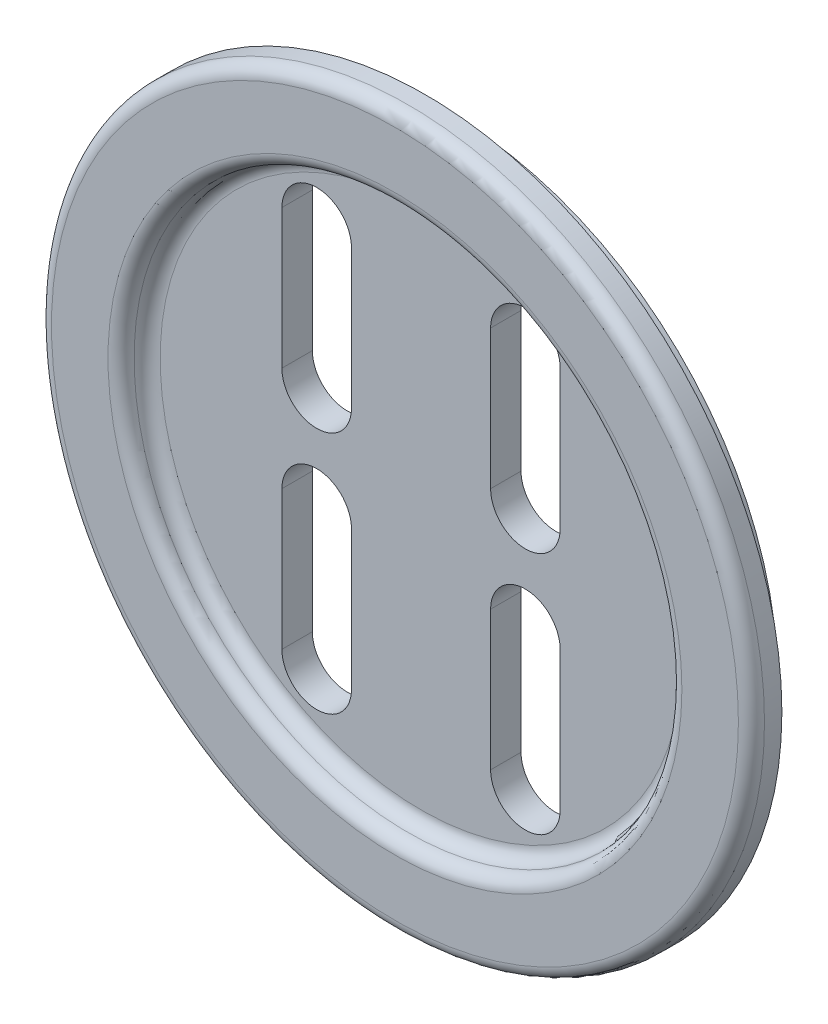
ISO-10303-21;
HEADER;
FILE_DESCRIPTION(('STEP AP214'),'2;1');
FILE_NAME('part.step','',(''),(''),'','','');
FILE_SCHEMA(('AUTOMOTIVE_DESIGN { 1 0 10303 214 1 1 1 1 }'));
ENDSEC;
DATA;
#1=APPLICATION_CONTEXT('core data for automotive mechanical design processes');
#2=APPLICATION_PROTOCOL_DEFINITION('international standard','automotive_design',2000,#1);
#3=PRODUCT_CONTEXT('',#1,'mechanical');
#4=PRODUCT('Part','Part','',(#3));
#5=PRODUCT_RELATED_PRODUCT_CATEGORY('part','',(#4));
#6=PRODUCT_DEFINITION_FORMATION('','',#4);
#7=PRODUCT_DEFINITION_CONTEXT('part definition',#1,'design');
#8=PRODUCT_DEFINITION('design','',#6,#7);
#9=PRODUCT_DEFINITION_SHAPE('','',#8);
#10=(LENGTH_UNIT() NAMED_UNIT(*) SI_UNIT(.MILLI.,.METRE.));
#11=(NAMED_UNIT(*) PLANE_ANGLE_UNIT() SI_UNIT($,.RADIAN.));
#12=(NAMED_UNIT(*) SI_UNIT($,.STERADIAN.) SOLID_ANGLE_UNIT());
#13=UNCERTAINTY_MEASURE_WITH_UNIT(LENGTH_MEASURE(1.E-05),#10,'distance_accuracy_value','');
#14=(GEOMETRIC_REPRESENTATION_CONTEXT(3) GLOBAL_UNCERTAINTY_ASSIGNED_CONTEXT((#13)) GLOBAL_UNIT_ASSIGNED_CONTEXT((#10,
#11,#12)) REPRESENTATION_CONTEXT('',''));
#15=CARTESIAN_POINT('',(0.,0.,0.));
#16=DIRECTION('',(0.,0.,1.));
#17=DIRECTION('',(1.,0.,0.));
#18=AXIS2_PLACEMENT_3D('',#15,#16,#17);
#19=CARTESIAN_POINT('',(0.,0.,-3.));
#20=DIRECTION('',(0.,0.,1.));
#21=DIRECTION('',(1.,0.,0.));
#22=AXIS2_PLACEMENT_3D('',#19,#20,#21);
#23=PLANE('',#22);
#24=DIRECTION('',(0.,-1.,0.));
#25=VECTOR('',#24,1.);
#26=CARTESIAN_POINT('',(16.,0.,-3.));
#27=LINE('',#26,#25);
#28=CARTESIAN_POINT('',(16.,22.,-3.));
#29=VERTEX_POINT('',#28);
#30=CARTESIAN_POINT('',(16.,6.,-3.));
#31=VERTEX_POINT('',#30);
#32=EDGE_CURVE('E204',#29,#31,#27,.T.);
#33=ORIENTED_EDGE('',*,*,#32,.F.);
#34=CARTESIAN_POINT('',(12.,22.,-3.));
#35=DIRECTION('',(0.,0.,1.));
#36=DIRECTION('',(1.,0.,0.));
#37=AXIS2_PLACEMENT_3D('',#34,#35,#36);
#38=CIRCLE('',#37,4.);
#39=CARTESIAN_POINT('',(8.,22.,-3.));
#40=VERTEX_POINT('',#39);
#41=EDGE_CURVE('E206',#29,#40,#38,.T.);
#42=ORIENTED_EDGE('',*,*,#41,.T.);
#43=DIRECTION('',(0.,-1.,0.));
#44=VECTOR('',#43,1.);
#45=CARTESIAN_POINT('',(8.,0.,-3.));
#46=LINE('',#45,#44);
#47=CARTESIAN_POINT('',(8.,6.,-3.));
#48=VERTEX_POINT('',#47);
#49=EDGE_CURVE('E199',#40,#48,#46,.T.);
#50=ORIENTED_EDGE('',*,*,#49,.T.);
#51=CARTESIAN_POINT('',(12.,6.,-3.));
#52=DIRECTION('',(0.,0.,1.));
#53=DIRECTION('',(1.,0.,0.));
#54=AXIS2_PLACEMENT_3D('',#51,#52,#53);
#55=CIRCLE('',#54,4.);
#56=EDGE_CURVE('E202',#31,#48,#55,.F.);
#57=ORIENTED_EDGE('',*,*,#56,.F.);
#58=EDGE_LOOP('',(#33,#42,#50,#57));
#59=FACE_BOUND('',#58,.T.);
#60=DIRECTION('',(0.,1.,0.));
#61=VECTOR('',#60,1.);
#62=CARTESIAN_POINT('',(-16.,0.,-3.));
#63=LINE('',#62,#61);
#64=CARTESIAN_POINT('',(-16.,-22.,-3.));
#65=VERTEX_POINT('',#64);
#66=CARTESIAN_POINT('',(-16.,-6.,-3.));
#67=VERTEX_POINT('',#66);
#68=EDGE_CURVE('E194',#65,#67,#63,.T.);
#69=ORIENTED_EDGE('',*,*,#68,.F.);
#70=CARTESIAN_POINT('',(-12.,-22.,-3.));
#71=DIRECTION('',(0.,0.,1.));
#72=DIRECTION('',(1.,0.,0.));
#73=AXIS2_PLACEMENT_3D('',#70,#71,#72);
#74=CIRCLE('',#73,4.);
#75=CARTESIAN_POINT('',(-8.,-22.,-3.));
#76=VERTEX_POINT('',#75);
#77=EDGE_CURVE('E196',#65,#76,#74,.T.);
#78=ORIENTED_EDGE('',*,*,#77,.T.);
#79=DIRECTION('',(0.,1.,0.));
#80=VECTOR('',#79,1.);
#81=CARTESIAN_POINT('',(-8.,0.,-3.));
#82=LINE('',#81,#80);
#83=CARTESIAN_POINT('',(-8.,-6.,-3.));
#84=VERTEX_POINT('',#83);
#85=EDGE_CURVE('E189',#76,#84,#82,.T.);
#86=ORIENTED_EDGE('',*,*,#85,.T.);
#87=CARTESIAN_POINT('',(-12.,-6.,-3.));
#88=DIRECTION('',(0.,0.,1.));
#89=DIRECTION('',(1.,0.,0.));
#90=AXIS2_PLACEMENT_3D('',#87,#88,#89);
#91=CIRCLE('',#90,4.);
#92=EDGE_CURVE('E192',#67,#84,#91,.F.);
#93=ORIENTED_EDGE('',*,*,#92,.F.);
#94=EDGE_LOOP('',(#69,#78,#86,#93));
#95=FACE_BOUND('',#94,.T.);
#96=CARTESIAN_POINT('',(-12.,22.,-3.));
#97=DIRECTION('',(0.,0.,1.));
#98=DIRECTION('',(1.,0.,0.));
#99=AXIS2_PLACEMENT_3D('',#96,#97,#98);
#100=CIRCLE('',#99,4.);
#101=CARTESIAN_POINT('',(-16.,22.,-3.));
#102=VERTEX_POINT('',#101);
#103=CARTESIAN_POINT('',(-8.,22.,-3.));
#104=VERTEX_POINT('',#103);
#105=EDGE_CURVE('E165',#102,#104,#100,.F.);
#106=ORIENTED_EDGE('',*,*,#105,.F.);
#107=DIRECTION('',(0.,-1.,0.));
#108=VECTOR('',#107,1.);
#109=CARTESIAN_POINT('',(-16.,0.,-3.));
#110=LINE('',#109,#108);
#111=CARTESIAN_POINT('',(-16.,6.,-3.));
#112=VERTEX_POINT('',#111);
#113=EDGE_CURVE('E148',#102,#112,#110,.T.);
#114=ORIENTED_EDGE('',*,*,#113,.T.);
#115=CARTESIAN_POINT('',(-12.,6.,-3.));
#116=DIRECTION('',(0.,0.,1.));
#117=DIRECTION('',(1.,0.,0.));
#118=AXIS2_PLACEMENT_3D('',#115,#116,#117);
#119=CIRCLE('',#118,4.);
#120=CARTESIAN_POINT('',(-8.,6.,-3.));
#121=VERTEX_POINT('',#120);
#122=EDGE_CURVE('E159',#112,#121,#119,.T.);
#123=ORIENTED_EDGE('',*,*,#122,.T.);
#124=DIRECTION('',(0.,-1.,0.));
#125=VECTOR('',#124,1.);
#126=CARTESIAN_POINT('',(-8.,0.,-3.));
#127=LINE('',#126,#125);
#128=EDGE_CURVE('E174',#104,#121,#127,.T.);
#129=ORIENTED_EDGE('',*,*,#128,.F.);
#130=EDGE_LOOP('',(#106,#114,#123,#129));
#131=FACE_BOUND('',#130,.T.);
#132=CARTESIAN_POINT('',(0.,0.,-3.));
#133=DIRECTION('',(0.,0.,1.));
#134=DIRECTION('',(1.,0.,0.));
#135=AXIS2_PLACEMENT_3D('',#132,#133,#134);
#136=CIRCLE('',#135,37.5);
#137=CARTESIAN_POINT('',(37.5,0.,-3.));
#138=VERTEX_POINT('',#137);
#139=EDGE_CURVE('E210',#138,#138,#136,.T.);
#140=ORIENTED_EDGE('',*,*,#139,.F.);
#141=EDGE_LOOP('',(#140));
#142=FACE_BOUND('',#141,.T.);
#143=CARTESIAN_POINT('',(12.,-22.,-3.));
#144=DIRECTION('',(0.,0.,1.));
#145=DIRECTION('',(1.,0.,0.));
#146=AXIS2_PLACEMENT_3D('',#143,#144,#145);
#147=CIRCLE('',#146,4.);
#148=CARTESIAN_POINT('',(16.,-22.,-3.));
#149=VERTEX_POINT('',#148);
#150=CARTESIAN_POINT('',(8.,-22.,-3.));
#151=VERTEX_POINT('',#150);
#152=EDGE_CURVE('E187',#149,#151,#147,.F.);
#153=ORIENTED_EDGE('',*,*,#152,.F.);
#154=DIRECTION('',(0.,1.,0.));
#155=VECTOR('',#154,1.);
#156=CARTESIAN_POINT('',(16.,0.,-3.));
#157=LINE('',#156,#155);
#158=CARTESIAN_POINT('',(16.,-6.,-3.));
#159=VERTEX_POINT('',#158);
#160=EDGE_CURVE('E175',#149,#159,#157,.T.);
#161=ORIENTED_EDGE('',*,*,#160,.T.);
#162=CARTESIAN_POINT('',(12.,-6.,-3.));
#163=DIRECTION('',(0.,0.,1.));
#164=DIRECTION('',(1.,0.,0.));
#165=AXIS2_PLACEMENT_3D('',#162,#163,#164);
#166=CIRCLE('',#165,4.);
#167=CARTESIAN_POINT('',(8.,-6.,-3.));
#168=VERTEX_POINT('',#167);
#169=EDGE_CURVE('E178',#159,#168,#166,.T.);
#170=ORIENTED_EDGE('',*,*,#169,.T.);
#171=DIRECTION('',(0.,1.,0.));
#172=VECTOR('',#171,1.);
#173=CARTESIAN_POINT('',(8.,0.,-3.));
#174=LINE('',#173,#172);
#175=EDGE_CURVE('E185',#151,#168,#174,.T.);
#176=ORIENTED_EDGE('',*,*,#175,.F.);
#177=EDGE_LOOP('',(#153,#161,#170,#176));
#178=FACE_BOUND('',#177,.T.);
#179=ADVANCED_FACE('F35',(#59,#95,#131,#142,#178),#23,.F.);
#180=CARTESIAN_POINT('',(0.,0.,0.5));
#181=DIRECTION('',(0.,0.,1.));
#182=DIRECTION('',(1.,0.,0.));
#183=AXIS2_PLACEMENT_3D('',#180,#181,#182);
#184=PLANE('',#183);
#185=CARTESIAN_POINT('',(0.,0.,0.5));
#186=DIRECTION('',(0.,0.,1.));
#187=DIRECTION('',(1.,0.,0.));
#188=AXIS2_PLACEMENT_3D('',#185,#186,#187);
#189=CIRCLE('',#188,30.);
#190=CARTESIAN_POINT('',(30.,0.,0.5));
#191=VERTEX_POINT('',#190);
#192=EDGE_CURVE('E258',#191,#191,#189,.T.);
#193=ORIENTED_EDGE('',*,*,#192,.T.);
#194=EDGE_LOOP('',(#193));
#195=FACE_BOUND('',#194,.T.);
#196=CARTESIAN_POINT('',(12.,22.,0.5));
#197=DIRECTION('',(0.,0.,1.));
#198=DIRECTION('',(1.,0.,0.));
#199=AXIS2_PLACEMENT_3D('',#196,#197,#198);
#200=CIRCLE('',#199,4.);
#201=CARTESIAN_POINT('',(16.,22.,0.5));
#202=VERTEX_POINT('',#201);
#203=CARTESIAN_POINT('',(8.,22.,0.5));
#204=VERTEX_POINT('',#203);
#205=EDGE_CURVE('E255',#202,#204,#200,.T.);
#206=ORIENTED_EDGE('',*,*,#205,.F.);
#207=DIRECTION('',(0.,-1.,0.));
#208=VECTOR('',#207,1.);
#209=CARTESIAN_POINT('',(16.,0.,0.5));
#210=LINE('',#209,#208);
#211=CARTESIAN_POINT('',(16.,6.,0.5));
#212=VERTEX_POINT('',#211);
#213=EDGE_CURVE('E252',#202,#212,#210,.T.);
#214=ORIENTED_EDGE('',*,*,#213,.T.);
#215=CARTESIAN_POINT('',(12.,6.,0.5));
#216=DIRECTION('',(0.,0.,1.));
#217=DIRECTION('',(1.,0.,0.));
#218=AXIS2_PLACEMENT_3D('',#215,#216,#217);
#219=CIRCLE('',#218,4.);
#220=CARTESIAN_POINT('',(8.,6.,0.5));
#221=VERTEX_POINT('',#220);
#222=EDGE_CURVE('E249',#212,#221,#219,.F.);
#223=ORIENTED_EDGE('',*,*,#222,.T.);
#224=DIRECTION('',(0.,-1.,0.));
#225=VECTOR('',#224,1.);
#226=CARTESIAN_POINT('',(8.,0.,0.5));
#227=LINE('',#226,#225);
#228=EDGE_CURVE('E247',#204,#221,#227,.T.);
#229=ORIENTED_EDGE('',*,*,#228,.F.);
#230=EDGE_LOOP('',(#206,#214,#223,#229));
#231=FACE_BOUND('',#230,.T.);
#232=CARTESIAN_POINT('',(-12.,-22.,0.5));
#233=DIRECTION('',(0.,0.,1.));
#234=DIRECTION('',(1.,0.,0.));
#235=AXIS2_PLACEMENT_3D('',#232,#233,#234);
#236=CIRCLE('',#235,4.);
#237=CARTESIAN_POINT('',(-16.,-22.,0.5));
#238=VERTEX_POINT('',#237);
#239=CARTESIAN_POINT('',(-8.,-22.,0.5));
#240=VERTEX_POINT('',#239);
#241=EDGE_CURVE('E244',#238,#240,#236,.T.);
#242=ORIENTED_EDGE('',*,*,#241,.F.);
#243=DIRECTION('',(0.,1.,0.));
#244=VECTOR('',#243,1.);
#245=CARTESIAN_POINT('',(-16.,0.,0.5));
#246=LINE('',#245,#244);
#247=CARTESIAN_POINT('',(-16.,-6.,0.5));
#248=VERTEX_POINT('',#247);
#249=EDGE_CURVE('E241',#238,#248,#246,.T.);
#250=ORIENTED_EDGE('',*,*,#249,.T.);
#251=CARTESIAN_POINT('',(-12.,-6.,0.5));
#252=DIRECTION('',(0.,0.,1.));
#253=DIRECTION('',(1.,0.,0.));
#254=AXIS2_PLACEMENT_3D('',#251,#252,#253);
#255=CIRCLE('',#254,4.);
#256=CARTESIAN_POINT('',(-8.,-6.,0.5));
#257=VERTEX_POINT('',#256);
#258=EDGE_CURVE('E238',#248,#257,#255,.F.);
#259=ORIENTED_EDGE('',*,*,#258,.T.);
#260=DIRECTION('',(0.,1.,0.));
#261=VECTOR('',#260,1.);
#262=CARTESIAN_POINT('',(-8.,0.,0.5));
#263=LINE('',#262,#261);
#264=EDGE_CURVE('E236',#240,#257,#263,.T.);
#265=ORIENTED_EDGE('',*,*,#264,.F.);
#266=EDGE_LOOP('',(#242,#250,#259,#265));
#267=FACE_BOUND('',#266,.T.);
#268=DIRECTION('',(0.,-1.,0.));
#269=VECTOR('',#268,1.);
#270=CARTESIAN_POINT('',(-16.,0.,0.5));
#271=LINE('',#270,#269);
#272=CARTESIAN_POINT('',(-16.,22.,0.5));
#273=VERTEX_POINT('',#272);
#274=CARTESIAN_POINT('',(-16.,6.,0.5));
#275=VERTEX_POINT('',#274);
#276=EDGE_CURVE('E218',#273,#275,#271,.T.);
#277=ORIENTED_EDGE('',*,*,#276,.F.);
#278=CARTESIAN_POINT('',(-12.,22.,0.5));
#279=DIRECTION('',(0.,0.,1.));
#280=DIRECTION('',(1.,0.,0.));
#281=AXIS2_PLACEMENT_3D('',#278,#279,#280);
#282=CIRCLE('',#281,4.);
#283=CARTESIAN_POINT('',(-8.,22.,0.5));
#284=VERTEX_POINT('',#283);
#285=EDGE_CURVE('E168',#273,#284,#282,.F.);
#286=ORIENTED_EDGE('',*,*,#285,.T.);
#287=DIRECTION('',(0.,-1.,0.));
#288=VECTOR('',#287,1.);
#289=CARTESIAN_POINT('',(-8.,0.,0.5));
#290=LINE('',#289,#288);
#291=CARTESIAN_POINT('',(-8.,6.,0.5));
#292=VERTEX_POINT('',#291);
#293=EDGE_CURVE('E222',#284,#292,#290,.T.);
#294=ORIENTED_EDGE('',*,*,#293,.T.);
#295=CARTESIAN_POINT('',(-12.,6.,0.5));
#296=DIRECTION('',(0.,0.,1.));
#297=DIRECTION('',(1.,0.,0.));
#298=AXIS2_PLACEMENT_3D('',#295,#296,#297);
#299=CIRCLE('',#298,4.);
#300=EDGE_CURVE('E220',#275,#292,#299,.T.);
#301=ORIENTED_EDGE('',*,*,#300,.F.);
#302=EDGE_LOOP('',(#277,#286,#294,#301));
#303=FACE_BOUND('',#302,.T.);
#304=DIRECTION('',(0.,1.,0.));
#305=VECTOR('',#304,1.);
#306=CARTESIAN_POINT('',(16.,0.,0.5));
#307=LINE('',#306,#305);
#308=CARTESIAN_POINT('',(16.,-22.,0.5));
#309=VERTEX_POINT('',#308);
#310=CARTESIAN_POINT('',(16.,-6.,0.5));
#311=VERTEX_POINT('',#310);
#312=EDGE_CURVE('E226',#309,#311,#307,.T.);
#313=ORIENTED_EDGE('',*,*,#312,.F.);
#314=CARTESIAN_POINT('',(12.,-22.,0.5));
#315=DIRECTION('',(0.,0.,1.));
#316=DIRECTION('',(1.,0.,0.));
#317=AXIS2_PLACEMENT_3D('',#314,#315,#316);
#318=CIRCLE('',#317,4.);
#319=CARTESIAN_POINT('',(8.,-22.,0.5));
#320=VERTEX_POINT('',#319);
#321=EDGE_CURVE('E233',#309,#320,#318,.F.);
#322=ORIENTED_EDGE('',*,*,#321,.T.);
#323=DIRECTION('',(0.,1.,0.));
#324=VECTOR('',#323,1.);
#325=CARTESIAN_POINT('',(8.,0.,0.5));
#326=LINE('',#325,#324);
#327=CARTESIAN_POINT('',(8.,-6.,0.5));
#328=VERTEX_POINT('',#327);
#329=EDGE_CURVE('E230',#320,#328,#326,.T.);
#330=ORIENTED_EDGE('',*,*,#329,.T.);
#331=CARTESIAN_POINT('',(12.,-6.,0.5));
#332=DIRECTION('',(0.,0.,1.));
#333=DIRECTION('',(1.,0.,0.));
#334=AXIS2_PLACEMENT_3D('',#331,#332,#333);
#335=CIRCLE('',#334,4.);
#336=EDGE_CURVE('E228',#311,#328,#335,.T.);
#337=ORIENTED_EDGE('',*,*,#336,.F.);
#338=EDGE_LOOP('',(#313,#322,#330,#337));
#339=FACE_BOUND('',#338,.T.);
#340=ADVANCED_FACE('F321',(#195,#231,#267,#303,#339),#184,.T.);
#341=CARTESIAN_POINT('',(0.,0.,3.5));
#342=DIRECTION('',(0.,0.,-1.));
#343=DIRECTION('',(-1.,0.,0.));
#344=AXIS2_PLACEMENT_3D('',#341,#342,#343);
#345=CYLINDRICAL_SURFACE('',#344,41.);
#346=CARTESIAN_POINT('',(0.,0.,2.));
#347=DIRECTION('',(0.,0.,1.));
#348=DIRECTION('',(1.,0.,0.));
#349=AXIS2_PLACEMENT_3D('',#346,#347,#348);
#350=CIRCLE('',#349,41.);
#351=CARTESIAN_POINT('',(41.,0.,2.));
#352=VERTEX_POINT('',#351);
#353=EDGE_CURVE('E11',#352,#352,#350,.F.);
#354=ORIENTED_EDGE('',*,*,#353,.T.);
#355=EDGE_LOOP('',(#354));
#356=FACE_BOUND('',#355,.T.);
#357=CARTESIAN_POINT('',(0.,0.,0.));
#358=DIRECTION('',(0.,0.,1.));
#359=DIRECTION('',(1.,0.,0.));
#360=AXIS2_PLACEMENT_3D('',#357,#358,#359);
#361=CIRCLE('',#360,41.);
#362=CARTESIAN_POINT('',(41.,0.,0.));
#363=VERTEX_POINT('',#362);
#364=EDGE_CURVE('E213',#363,#363,#361,.T.);
#365=ORIENTED_EDGE('',*,*,#364,.T.);
#366=EDGE_LOOP('',(#365));
#367=FACE_BOUND('',#366,.T.);
#368=ADVANCED_FACE('F324',(#356,#367),#345,.T.);
#369=CARTESIAN_POINT('',(0.,0.,3.5));
#370=DIRECTION('',(0.,0.,1.));
#371=DIRECTION('',(1.,0.,0.));
#372=AXIS2_PLACEMENT_3D('',#369,#370,#371);
#373=PLANE('',#372);
#374=CARTESIAN_POINT('',(0.,0.,3.5));
#375=DIRECTION('',(0.,0.,1.));
#376=DIRECTION('',(1.,0.,0.));
#377=AXIS2_PLACEMENT_3D('',#374,#375,#376);
#378=CIRCLE('',#377,33.);
#379=CARTESIAN_POINT('',(33.,0.,3.5));
#380=VERTEX_POINT('',#379);
#381=EDGE_CURVE('E44',#380,#380,#378,.F.);
#382=ORIENTED_EDGE('',*,*,#381,.T.);
#383=EDGE_LOOP('',(#382));
#384=FACE_BOUND('',#383,.T.);
#385=CARTESIAN_POINT('',(0.,0.,3.5));
#386=DIRECTION('',(0.,0.,1.));
#387=DIRECTION('',(1.,0.,0.));
#388=AXIS2_PLACEMENT_3D('',#385,#386,#387);
#389=CIRCLE('',#388,39.5);
#390=CARTESIAN_POINT('',(39.5,0.,3.5));
#391=VERTEX_POINT('',#390);
#392=EDGE_CURVE('E261',#391,#391,#389,.T.);
#393=ORIENTED_EDGE('',*,*,#392,.T.);
#394=EDGE_LOOP('',(#393));
#395=FACE_BOUND('',#394,.T.);
#396=ADVANCED_FACE('F267',(#384,#395),#373,.T.);
#397=CARTESIAN_POINT('',(0.,0.,0.));
#398=DIRECTION('',(0.,0.,1.));
#399=DIRECTION('',(1.,0.,0.));
#400=AXIS2_PLACEMENT_3D('',#397,#398,#399);
#401=PLANE('',#400);
#402=CARTESIAN_POINT('',(0.,0.,0.));
#403=DIRECTION('',(0.,0.,1.));
#404=DIRECTION('',(1.,0.,0.));
#405=AXIS2_PLACEMENT_3D('',#402,#403,#404);
#406=CIRCLE('',#405,37.5);
#407=CARTESIAN_POINT('',(37.5,0.,0.));
#408=VERTEX_POINT('',#407);
#409=EDGE_CURVE('E209',#408,#408,#406,.T.);
#410=ORIENTED_EDGE('',*,*,#409,.T.);
#411=EDGE_LOOP('',(#410));
#412=FACE_BOUND('',#411,.T.);
#413=ORIENTED_EDGE('',*,*,#364,.F.);
#414=EDGE_LOOP('',(#413));
#415=FACE_BOUND('',#414,.T.);
#416=ADVANCED_FACE('F362',(#412,#415),#401,.F.);
#417=CARTESIAN_POINT('',(0.,0.,-3.));
#418=DIRECTION('',(0.,0.,1.));
#419=DIRECTION('',(1.,0.,0.));
#420=AXIS2_PLACEMENT_3D('',#417,#418,#419);
#421=CYLINDRICAL_SURFACE('',#420,37.5);
#422=ORIENTED_EDGE('',*,*,#139,.T.);
#423=EDGE_LOOP('',(#422));
#424=FACE_BOUND('',#423,.T.);
#425=ORIENTED_EDGE('',*,*,#409,.F.);
#426=EDGE_LOOP('',(#425));
#427=FACE_BOUND('',#426,.T.);
#428=ADVANCED_FACE('F359',(#424,#427),#421,.T.);
#429=CARTESIAN_POINT('',(-12.,22.,-17.5));
#430=DIRECTION('',(0.,0.,1.));
#431=DIRECTION('',(1.,0.,0.));
#432=AXIS2_PLACEMENT_3D('',#429,#430,#431);
#433=CYLINDRICAL_SURFACE('',#432,4.);
#434=ORIENTED_EDGE('',*,*,#105,.T.);
#435=DIRECTION('',(0.,0.,1.));
#436=VECTOR('',#435,1.);
#437=CARTESIAN_POINT('',(-8.,22.,-17.5));
#438=LINE('',#437,#436);
#439=EDGE_CURVE('E160',#104,#284,#438,.T.);
#440=ORIENTED_EDGE('',*,*,#439,.T.);
#441=ORIENTED_EDGE('',*,*,#285,.F.);
#442=DIRECTION('',(0.,0.,1.));
#443=VECTOR('',#442,1.);
#444=CARTESIAN_POINT('',(-16.,22.,-17.5));
#445=LINE('',#444,#443);
#446=EDGE_CURVE('E151',#102,#273,#445,.T.);
#447=ORIENTED_EDGE('',*,*,#446,.F.);
#448=EDGE_LOOP('',(#434,#440,#441,#447));
#449=FACE_BOUND('',#448,.T.);
#450=ADVANCED_FACE('F163',(#449),#433,.F.);
#451=CARTESIAN_POINT('',(-8.,22.,-17.5));
#452=DIRECTION('',(-1.,0.,0.));
#453=DIRECTION('',(0.,0.,1.));
#454=AXIS2_PLACEMENT_3D('',#451,#452,#453);
#455=PLANE('',#454);
#456=ORIENTED_EDGE('',*,*,#128,.T.);
#457=DIRECTION('',(0.,0.,1.));
#458=VECTOR('',#457,1.);
#459=CARTESIAN_POINT('',(-8.,6.,-17.5));
#460=LINE('',#459,#458);
#461=EDGE_CURVE('E311',#121,#292,#460,.T.);
#462=ORIENTED_EDGE('',*,*,#461,.T.);
#463=ORIENTED_EDGE('',*,*,#293,.F.);
#464=ORIENTED_EDGE('',*,*,#439,.F.);
#465=EDGE_LOOP('',(#456,#462,#463,#464));
#466=FACE_BOUND('',#465,.T.);
#467=ADVANCED_FACE('F319',(#466),#455,.T.);
#468=CARTESIAN_POINT('',(-12.,6.,-17.5));
#469=DIRECTION('',(0.,0.,1.));
#470=DIRECTION('',(1.,0.,0.));
#471=AXIS2_PLACEMENT_3D('',#468,#469,#470);
#472=CYLINDRICAL_SURFACE('',#471,4.);
#473=DIRECTION('',(0.,0.,1.));
#474=VECTOR('',#473,1.);
#475=CARTESIAN_POINT('',(-16.,6.,-17.5));
#476=LINE('',#475,#474);
#477=EDGE_CURVE('E154',#112,#275,#476,.T.);
#478=ORIENTED_EDGE('',*,*,#477,.T.);
#479=ORIENTED_EDGE('',*,*,#300,.T.);
#480=ORIENTED_EDGE('',*,*,#461,.F.);
#481=ORIENTED_EDGE('',*,*,#122,.F.);
#482=EDGE_LOOP('',(#478,#479,#480,#481));
#483=FACE_BOUND('',#482,.T.);
#484=ADVANCED_FACE('F316',(#483),#472,.F.);
#485=CARTESIAN_POINT('',(-16.,22.,-17.5));
#486=DIRECTION('',(-1.,0.,0.));
#487=DIRECTION('',(0.,0.,1.));
#488=AXIS2_PLACEMENT_3D('',#485,#486,#487);
#489=PLANE('',#488);
#490=ORIENTED_EDGE('',*,*,#446,.T.);
#491=ORIENTED_EDGE('',*,*,#276,.T.);
#492=ORIENTED_EDGE('',*,*,#477,.F.);
#493=ORIENTED_EDGE('',*,*,#113,.F.);
#494=EDGE_LOOP('',(#490,#491,#492,#493));
#495=FACE_BOUND('',#494,.T.);
#496=ADVANCED_FACE('F150',(#495),#489,.F.);
#497=CARTESIAN_POINT('',(12.,-22.,-17.5));
#498=DIRECTION('',(0.,0.,1.));
#499=DIRECTION('',(1.,0.,0.));
#500=AXIS2_PLACEMENT_3D('',#497,#498,#499);
#501=CYLINDRICAL_SURFACE('',#500,4.);
#502=ORIENTED_EDGE('',*,*,#152,.T.);
#503=DIRECTION('',(0.,0.,1.));
#504=VECTOR('',#503,1.);
#505=CARTESIAN_POINT('',(8.,-22.,-17.5));
#506=LINE('',#505,#504);
#507=EDGE_CURVE('E278',#151,#320,#506,.T.);
#508=ORIENTED_EDGE('',*,*,#507,.T.);
#509=ORIENTED_EDGE('',*,*,#321,.F.);
#510=DIRECTION('',(0.,0.,1.));
#511=VECTOR('',#510,1.);
#512=CARTESIAN_POINT('',(16.,-22.,-17.5));
#513=LINE('',#512,#511);
#514=EDGE_CURVE('E291',#149,#309,#513,.T.);
#515=ORIENTED_EDGE('',*,*,#514,.F.);
#516=EDGE_LOOP('',(#502,#508,#509,#515));
#517=FACE_BOUND('',#516,.T.);
#518=ADVANCED_FACE('F339',(#517),#501,.F.);
#519=CARTESIAN_POINT('',(8.,-22.,-17.5));
#520=DIRECTION('',(1.,0.,0.));
#521=DIRECTION('',(0.,0.,-1.));
#522=AXIS2_PLACEMENT_3D('',#519,#520,#521);
#523=PLANE('',#522);
#524=ORIENTED_EDGE('',*,*,#175,.T.);
#525=DIRECTION('',(0.,0.,1.));
#526=VECTOR('',#525,1.);
#527=CARTESIAN_POINT('',(8.,-6.,-17.5));
#528=LINE('',#527,#526);
#529=EDGE_CURVE('E280',#168,#328,#528,.T.);
#530=ORIENTED_EDGE('',*,*,#529,.T.);
#531=ORIENTED_EDGE('',*,*,#329,.F.);
#532=ORIENTED_EDGE('',*,*,#507,.F.);
#533=EDGE_LOOP('',(#524,#530,#531,#532));
#534=FACE_BOUND('',#533,.T.);
#535=ADVANCED_FACE('F341',(#534),#523,.T.);
#536=CARTESIAN_POINT('',(12.,-6.,-17.5));
#537=DIRECTION('',(0.,0.,1.));
#538=DIRECTION('',(1.,0.,0.));
#539=AXIS2_PLACEMENT_3D('',#536,#537,#538);
#540=CYLINDRICAL_SURFACE('',#539,4.);
#541=DIRECTION('',(0.,0.,1.));
#542=VECTOR('',#541,1.);
#543=CARTESIAN_POINT('',(16.,-6.,-17.5));
#544=LINE('',#543,#542);
#545=EDGE_CURVE('E286',#159,#311,#544,.T.);
#546=ORIENTED_EDGE('',*,*,#545,.T.);
#547=ORIENTED_EDGE('',*,*,#336,.T.);
#548=ORIENTED_EDGE('',*,*,#529,.F.);
#549=ORIENTED_EDGE('',*,*,#169,.F.);
#550=EDGE_LOOP('',(#546,#547,#548,#549));
#551=FACE_BOUND('',#550,.T.);
#552=ADVANCED_FACE('F334',(#551),#540,.F.);
#553=CARTESIAN_POINT('',(16.,-22.,-17.5));
#554=DIRECTION('',(1.,0.,0.));
#555=DIRECTION('',(0.,0.,-1.));
#556=AXIS2_PLACEMENT_3D('',#553,#554,#555);
#557=PLANE('',#556);
#558=ORIENTED_EDGE('',*,*,#514,.T.);
#559=ORIENTED_EDGE('',*,*,#312,.T.);
#560=ORIENTED_EDGE('',*,*,#545,.F.);
#561=ORIENTED_EDGE('',*,*,#160,.F.);
#562=EDGE_LOOP('',(#558,#559,#560,#561));
#563=FACE_BOUND('',#562,.T.);
#564=ADVANCED_FACE('F330',(#563),#557,.F.);
#565=CARTESIAN_POINT('',(-12.,-22.,-17.5));
#566=DIRECTION('',(0.,0.,1.));
#567=DIRECTION('',(1.,0.,0.));
#568=AXIS2_PLACEMENT_3D('',#565,#566,#567);
#569=CYLINDRICAL_SURFACE('',#568,4.);
#570=DIRECTION('',(0.,0.,1.));
#571=VECTOR('',#570,1.);
#572=CARTESIAN_POINT('',(-16.,-22.,-17.5));
#573=LINE('',#572,#571);
#574=EDGE_CURVE('E293',#65,#238,#573,.T.);
#575=ORIENTED_EDGE('',*,*,#574,.T.);
#576=ORIENTED_EDGE('',*,*,#241,.T.);
#577=DIRECTION('',(0.,0.,1.));
#578=VECTOR('',#577,1.);
#579=CARTESIAN_POINT('',(-8.,-22.,-17.5));
#580=LINE('',#579,#578);
#581=EDGE_CURVE('E302',#76,#240,#580,.T.);
#582=ORIENTED_EDGE('',*,*,#581,.F.);
#583=ORIENTED_EDGE('',*,*,#77,.F.);
#584=EDGE_LOOP('',(#575,#576,#582,#583));
#585=FACE_BOUND('',#584,.T.);
#586=ADVANCED_FACE('F387',(#585),#569,.F.);
#587=CARTESIAN_POINT('',(-16.,-22.,-17.5));
#588=DIRECTION('',(1.,0.,0.));
#589=DIRECTION('',(0.,0.,-1.));
#590=AXIS2_PLACEMENT_3D('',#587,#588,#589);
#591=PLANE('',#590);
#592=ORIENTED_EDGE('',*,*,#68,.T.);
#593=DIRECTION('',(0.,0.,1.));
#594=VECTOR('',#593,1.);
#595=CARTESIAN_POINT('',(-16.,-6.,-17.5));
#596=LINE('',#595,#594);
#597=EDGE_CURVE('E305',#67,#248,#596,.T.);
#598=ORIENTED_EDGE('',*,*,#597,.T.);
#599=ORIENTED_EDGE('',*,*,#249,.F.);
#600=ORIENTED_EDGE('',*,*,#574,.F.);
#601=EDGE_LOOP('',(#592,#598,#599,#600));
#602=FACE_BOUND('',#601,.T.);
#603=ADVANCED_FACE('F391',(#602),#591,.T.);
#604=CARTESIAN_POINT('',(-12.,-6.,-17.5));
#605=DIRECTION('',(0.,0.,1.));
#606=DIRECTION('',(1.,0.,0.));
#607=AXIS2_PLACEMENT_3D('',#604,#605,#606);
#608=CYLINDRICAL_SURFACE('',#607,4.);
#609=ORIENTED_EDGE('',*,*,#92,.T.);
#610=DIRECTION('',(0.,0.,1.));
#611=VECTOR('',#610,1.);
#612=CARTESIAN_POINT('',(-8.,-6.,-17.5));
#613=LINE('',#612,#611);
#614=EDGE_CURVE('E59',#84,#257,#613,.T.);
#615=ORIENTED_EDGE('',*,*,#614,.T.);
#616=ORIENTED_EDGE('',*,*,#258,.F.);
#617=ORIENTED_EDGE('',*,*,#597,.F.);
#618=EDGE_LOOP('',(#609,#615,#616,#617));
#619=FACE_BOUND('',#618,.T.);
#620=ADVANCED_FACE('F395',(#619),#608,.F.);
#621=CARTESIAN_POINT('',(-8.,-22.,-17.5));
#622=DIRECTION('',(1.,0.,0.));
#623=DIRECTION('',(0.,0.,-1.));
#624=AXIS2_PLACEMENT_3D('',#621,#622,#623);
#625=PLANE('',#624);
#626=ORIENTED_EDGE('',*,*,#581,.T.);
#627=ORIENTED_EDGE('',*,*,#264,.T.);
#628=ORIENTED_EDGE('',*,*,#614,.F.);
#629=ORIENTED_EDGE('',*,*,#85,.F.);
#630=EDGE_LOOP('',(#626,#627,#628,#629));
#631=FACE_BOUND('',#630,.T.);
#632=ADVANCED_FACE('F397',(#631),#625,.F.);
#633=CARTESIAN_POINT('',(12.,22.,-17.5));
#634=DIRECTION('',(0.,0.,1.));
#635=DIRECTION('',(1.,0.,0.));
#636=AXIS2_PLACEMENT_3D('',#633,#634,#635);
#637=CYLINDRICAL_SURFACE('',#636,4.);
#638=DIRECTION('',(0.,0.,1.));
#639=VECTOR('',#638,1.);
#640=CARTESIAN_POINT('',(16.,22.,-17.5));
#641=LINE('',#640,#639);
#642=EDGE_CURVE('E299',#29,#202,#641,.T.);
#643=ORIENTED_EDGE('',*,*,#642,.T.);
#644=ORIENTED_EDGE('',*,*,#205,.T.);
#645=DIRECTION('',(0.,0.,1.));
#646=VECTOR('',#645,1.);
#647=CARTESIAN_POINT('',(8.,22.,-17.5));
#648=LINE('',#647,#646);
#649=EDGE_CURVE('E170',#40,#204,#648,.T.);
#650=ORIENTED_EDGE('',*,*,#649,.F.);
#651=ORIENTED_EDGE('',*,*,#41,.F.);
#652=EDGE_LOOP('',(#643,#644,#650,#651));
#653=FACE_BOUND('',#652,.T.);
#654=ADVANCED_FACE('F403',(#653),#637,.F.);
#655=CARTESIAN_POINT('',(16.,22.,-17.5));
#656=DIRECTION('',(-1.,0.,0.));
#657=DIRECTION('',(0.,0.,1.));
#658=AXIS2_PLACEMENT_3D('',#655,#656,#657);
#659=PLANE('',#658);
#660=ORIENTED_EDGE('',*,*,#32,.T.);
#661=DIRECTION('',(0.,0.,1.));
#662=VECTOR('',#661,1.);
#663=CARTESIAN_POINT('',(16.,6.,-17.5));
#664=LINE('',#663,#662);
#665=EDGE_CURVE('E296',#31,#212,#664,.T.);
#666=ORIENTED_EDGE('',*,*,#665,.T.);
#667=ORIENTED_EDGE('',*,*,#213,.F.);
#668=ORIENTED_EDGE('',*,*,#642,.F.);
#669=EDGE_LOOP('',(#660,#666,#667,#668));
#670=FACE_BOUND('',#669,.T.);
#671=ADVANCED_FACE('F484',(#670),#659,.T.);
#672=CARTESIAN_POINT('',(12.,6.,-17.5));
#673=DIRECTION('',(0.,0.,1.));
#674=DIRECTION('',(1.,0.,0.));
#675=AXIS2_PLACEMENT_3D('',#672,#673,#674);
#676=CYLINDRICAL_SURFACE('',#675,4.);
#677=ORIENTED_EDGE('',*,*,#56,.T.);
#678=DIRECTION('',(0.,0.,1.));
#679=VECTOR('',#678,1.);
#680=CARTESIAN_POINT('',(8.,6.,-17.5));
#681=LINE('',#680,#679);
#682=EDGE_CURVE('E51',#48,#221,#681,.T.);
#683=ORIENTED_EDGE('',*,*,#682,.T.);
#684=ORIENTED_EDGE('',*,*,#222,.F.);
#685=ORIENTED_EDGE('',*,*,#665,.F.);
#686=EDGE_LOOP('',(#677,#683,#684,#685));
#687=FACE_BOUND('',#686,.T.);
#688=ADVANCED_FACE('F494',(#687),#676,.F.);
#689=CARTESIAN_POINT('',(8.,22.,-17.5));
#690=DIRECTION('',(-1.,0.,0.));
#691=DIRECTION('',(0.,0.,1.));
#692=AXIS2_PLACEMENT_3D('',#689,#690,#691);
#693=PLANE('',#692);
#694=ORIENTED_EDGE('',*,*,#649,.T.);
#695=ORIENTED_EDGE('',*,*,#228,.T.);
#696=ORIENTED_EDGE('',*,*,#682,.F.);
#697=ORIENTED_EDGE('',*,*,#49,.F.);
#698=EDGE_LOOP('',(#694,#695,#696,#697));
#699=FACE_BOUND('',#698,.T.);
#700=ADVANCED_FACE('F274',(#699),#693,.F.);
#701=CARTESIAN_POINT('',(0.,0.,2.));
#702=DIRECTION('',(0.,0.,1.));
#703=DIRECTION('',(1.,0.,0.));
#704=AXIS2_PLACEMENT_3D('',#701,#702,#703);
#705=TOROIDAL_SURFACE('',#704,33.,1.5);
#706=ORIENTED_EDGE('',*,*,#381,.F.);
#707=EDGE_LOOP('',(#706));
#708=FACE_BOUND('',#707,.T.);
#709=CARTESIAN_POINT('',(0.,0.,2.));
#710=DIRECTION('',(0.,0.,1.));
#711=DIRECTION('',(1.,0.,0.));
#712=AXIS2_PLACEMENT_3D('',#709,#710,#711);
#713=CIRCLE('',#712,31.5);
#714=CARTESIAN_POINT('',(31.5,0.,2.));
#715=VERTEX_POINT('',#714);
#716=EDGE_CURVE('E39',#715,#715,#713,.T.);
#717=ORIENTED_EDGE('',*,*,#716,.F.);
#718=EDGE_LOOP('',(#717));
#719=FACE_BOUND('',#718,.T.);
#720=ADVANCED_FACE('F270',(#708,#719),#705,.T.);
#721=CARTESIAN_POINT('',(0.,0.,2.));
#722=DIRECTION('',(0.,0.,1.));
#723=DIRECTION('',(1.,0.,0.));
#724=AXIS2_PLACEMENT_3D('',#721,#722,#723);
#725=TOROIDAL_SURFACE('',#724,30.,1.5);
#726=ORIENTED_EDGE('',*,*,#716,.T.);
#727=EDGE_LOOP('',(#726));
#728=FACE_BOUND('',#727,.T.);
#729=ORIENTED_EDGE('',*,*,#192,.F.);
#730=EDGE_LOOP('',(#729));
#731=FACE_BOUND('',#730,.T.);
#732=ADVANCED_FACE('F273',(#728,#731),#725,.F.);
#733=CARTESIAN_POINT('',(0.,0.,2.));
#734=DIRECTION('',(0.,0.,1.));
#735=DIRECTION('',(1.,0.,0.));
#736=AXIS2_PLACEMENT_3D('',#733,#734,#735);
#737=TOROIDAL_SURFACE('',#736,39.5,1.5);
#738=ORIENTED_EDGE('',*,*,#353,.F.);
#739=EDGE_LOOP('',(#738));
#740=FACE_BOUND('',#739,.T.);
#741=ORIENTED_EDGE('',*,*,#392,.F.);
#742=EDGE_LOOP('',(#741));
#743=FACE_BOUND('',#742,.T.);
#744=ADVANCED_FACE('F37',(#740,#743),#737,.T.);
#745=CLOSED_SHELL('',(#179,#340,#368,#396,#416,#428,#450,#467,#484,#496,#518,#535,#552,#564,
#586,#603,#620,#632,#654,#671,#688,#700,#720,#732,#744));
#746=MANIFOLD_SOLID_BREP('B2',#745);
#747=ADVANCED_BREP_SHAPE_REPRESENTATION('',(#18,#746),#14);
#748=SHAPE_DEFINITION_REPRESENTATION(#9,#747);
ENDSEC;
END-ISO-10303-21;
